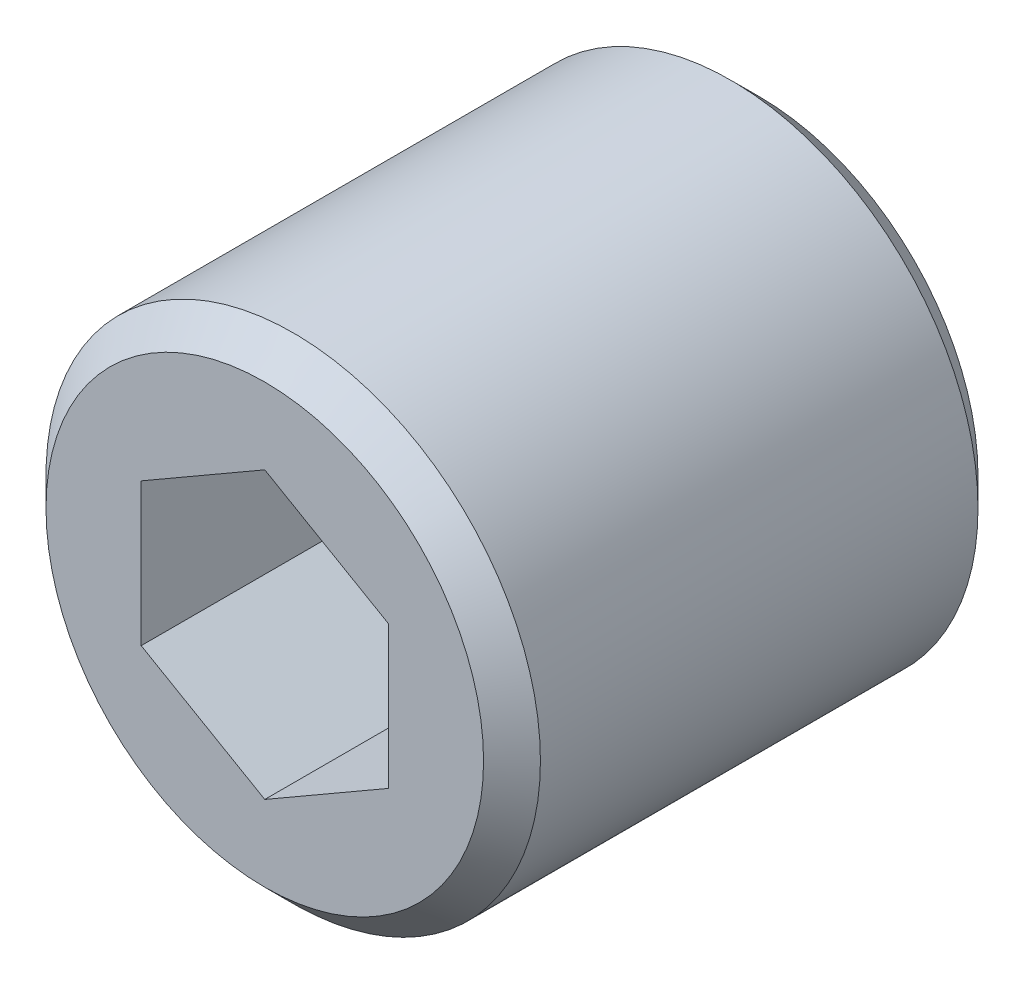
ISO-10303-21;
HEADER;
FILE_DESCRIPTION(('STEP AP214'),'2;1');
FILE_NAME('part.step','',(''),(''),'','','');
FILE_SCHEMA(('AUTOMOTIVE_DESIGN { 1 0 10303 214 1 1 1 1 }'));
ENDSEC;
DATA;
#1=APPLICATION_CONTEXT('core data for automotive mechanical design processes');
#2=APPLICATION_PROTOCOL_DEFINITION('international standard','automotive_design',2000,#1);
#3=PRODUCT_CONTEXT('',#1,'mechanical');
#4=PRODUCT('Part','Part','',(#3));
#5=PRODUCT_RELATED_PRODUCT_CATEGORY('part','',(#4));
#6=PRODUCT_DEFINITION_FORMATION('','',#4);
#7=PRODUCT_DEFINITION_CONTEXT('part definition',#1,'design');
#8=PRODUCT_DEFINITION('design','',#6,#7);
#9=PRODUCT_DEFINITION_SHAPE('','',#8);
#10=(LENGTH_UNIT() NAMED_UNIT(*) SI_UNIT(.MILLI.,.METRE.));
#11=(NAMED_UNIT(*) PLANE_ANGLE_UNIT() SI_UNIT($,.RADIAN.));
#12=(NAMED_UNIT(*) SI_UNIT($,.STERADIAN.) SOLID_ANGLE_UNIT());
#13=UNCERTAINTY_MEASURE_WITH_UNIT(LENGTH_MEASURE(1.E-05),#10,'distance_accuracy_value','');
#14=(GEOMETRIC_REPRESENTATION_CONTEXT(3) GLOBAL_UNCERTAINTY_ASSIGNED_CONTEXT((#13)) GLOBAL_UNIT_ASSIGNED_CONTEXT((#10,
#11,#12)) REPRESENTATION_CONTEXT('',''));
#15=CARTESIAN_POINT('',(0.,0.,0.));
#16=DIRECTION('',(0.,0.,1.));
#17=DIRECTION('',(1.,0.,0.));
#18=AXIS2_PLACEMENT_3D('',#15,#16,#17);
#19=CARTESIAN_POINT('',(0.,0.,8.));
#20=DIRECTION('',(0.,0.,-1.));
#21=DIRECTION('',(-1.,0.,0.));
#22=AXIS2_PLACEMENT_3D('',#19,#20,#21);
#23=PLANE('',#22);
#24=CARTESIAN_POINT('',(0.,0.,8.));
#25=DIRECTION('',(0.,0.,1.));
#26=DIRECTION('',(1.,0.,0.));
#27=AXIS2_PLACEMENT_3D('',#24,#25,#26);
#28=CIRCLE('',#27,3.54);
#29=CARTESIAN_POINT('',(3.54,0.,8.));
#30=VERTEX_POINT('',#29);
#31=EDGE_CURVE('E143',#30,#30,#28,.T.);
#32=ORIENTED_EDGE('',*,*,#31,.T.);
#33=EDGE_LOOP('',(#32));
#34=FACE_BOUND('',#33,.T.);
#35=DIRECTION('',(-0.866025403784439,-0.5,0.));
#36=VECTOR('',#35,1.);
#37=CARTESIAN_POINT('',(0.,2.3094010767585,8.));
#38=LINE('',#37,#36);
#39=CARTESIAN_POINT('',(0.,2.3094010767585,8.));
#40=VERTEX_POINT('',#39);
#41=CARTESIAN_POINT('',(-2.,1.15470053837925,8.));
#42=VERTEX_POINT('',#41);
#43=EDGE_CURVE('E111',#40,#42,#38,.T.);
#44=ORIENTED_EDGE('',*,*,#43,.F.);
#45=DIRECTION('',(-0.866025403784439,0.5,0.));
#46=VECTOR('',#45,1.);
#47=CARTESIAN_POINT('',(2.,1.15470053837925,8.));
#48=LINE('',#47,#46);
#49=CARTESIAN_POINT('',(2.,1.15470053837925,8.));
#50=VERTEX_POINT('',#49);
#51=EDGE_CURVE('E123',#50,#40,#48,.T.);
#52=ORIENTED_EDGE('',*,*,#51,.F.);
#53=DIRECTION('',(0.,1.,0.));
#54=VECTOR('',#53,1.);
#55=CARTESIAN_POINT('',(2.,-1.15470053837925,8.));
#56=LINE('',#55,#54);
#57=CARTESIAN_POINT('',(2.,-1.15470053837925,8.));
#58=VERTEX_POINT('',#57);
#59=EDGE_CURVE('E117',#58,#50,#56,.T.);
#60=ORIENTED_EDGE('',*,*,#59,.F.);
#61=DIRECTION('',(0.866025403784439,0.5,0.));
#62=VECTOR('',#61,1.);
#63=CARTESIAN_POINT('',(0.,-2.3094010767585,8.));
#64=LINE('',#63,#62);
#65=CARTESIAN_POINT('',(0.,-2.3094010767585,8.));
#66=VERTEX_POINT('',#65);
#67=EDGE_CURVE('E115',#66,#58,#64,.T.);
#68=ORIENTED_EDGE('',*,*,#67,.F.);
#69=DIRECTION('',(0.866025403784439,-0.5,0.));
#70=VECTOR('',#69,1.);
#71=CARTESIAN_POINT('',(-2.,-1.15470053837925,8.));
#72=LINE('',#71,#70);
#73=CARTESIAN_POINT('',(-2.,-1.15470053837925,8.));
#74=VERTEX_POINT('',#73);
#75=EDGE_CURVE('E96',#74,#66,#72,.T.);
#76=ORIENTED_EDGE('',*,*,#75,.F.);
#77=DIRECTION('',(0.,-1.,0.));
#78=VECTOR('',#77,1.);
#79=CARTESIAN_POINT('',(-2.,1.15470053837925,8.));
#80=LINE('',#79,#78);
#81=EDGE_CURVE('E105',#42,#74,#80,.T.);
#82=ORIENTED_EDGE('',*,*,#81,.F.);
#83=EDGE_LOOP('',(#44,#52,#60,#68,#76,#82));
#84=FACE_BOUND('',#83,.T.);
#85=ADVANCED_FACE('F37',(#34,#84),#23,.F.);
#86=CARTESIAN_POINT('',(0.,0.,7.54));
#87=DIRECTION('',(0.,0.,-1.));
#88=DIRECTION('',(-1.,0.,0.));
#89=AXIS2_PLACEMENT_3D('',#86,#87,#88);
#90=CONICAL_SURFACE('',#89,4.,0.785398163397448);
#91=ORIENTED_EDGE('',*,*,#31,.F.);
#92=EDGE_LOOP('',(#91));
#93=FACE_BOUND('',#92,.T.);
#94=CARTESIAN_POINT('',(0.,0.,7.54));
#95=DIRECTION('',(0.,0.,1.));
#96=DIRECTION('',(1.,0.,0.));
#97=AXIS2_PLACEMENT_3D('',#94,#95,#96);
#98=CIRCLE('',#97,4.);
#99=CARTESIAN_POINT('',(4.,0.,7.54));
#100=VERTEX_POINT('',#99);
#101=EDGE_CURVE('E140',#100,#100,#98,.T.);
#102=ORIENTED_EDGE('',*,*,#101,.T.);
#103=EDGE_LOOP('',(#102));
#104=FACE_BOUND('',#103,.T.);
#105=ADVANCED_FACE('F205',(#93,#104),#90,.T.);
#106=CARTESIAN_POINT('',(0.,0.,0.));
#107=DIRECTION('',(0.,0.,1.));
#108=DIRECTION('',(1.,0.,0.));
#109=AXIS2_PLACEMENT_3D('',#106,#107,#108);
#110=CYLINDRICAL_SURFACE('',#109,4.);
#111=ORIENTED_EDGE('',*,*,#101,.F.);
#112=EDGE_LOOP('',(#111));
#113=FACE_BOUND('',#112,.T.);
#114=CARTESIAN_POINT('',(0.,0.,0.46));
#115=DIRECTION('',(0.,0.,1.));
#116=DIRECTION('',(1.,0.,0.));
#117=AXIS2_PLACEMENT_3D('',#114,#115,#116);
#118=CIRCLE('',#117,4.);
#119=CARTESIAN_POINT('',(4.,0.,0.46));
#120=VERTEX_POINT('',#119);
#121=EDGE_CURVE('E137',#120,#120,#118,.T.);
#122=ORIENTED_EDGE('',*,*,#121,.T.);
#123=EDGE_LOOP('',(#122));
#124=FACE_BOUND('',#123,.T.);
#125=ADVANCED_FACE('F210',(#113,#124),#110,.T.);
#126=CARTESIAN_POINT('',(0.,0.,0.));
#127=DIRECTION('',(0.,0.,1.));
#128=DIRECTION('',(1.,0.,0.));
#129=AXIS2_PLACEMENT_3D('',#126,#127,#128);
#130=CONICAL_SURFACE('',#129,3.54,0.785398163397448);
#131=ORIENTED_EDGE('',*,*,#121,.F.);
#132=EDGE_LOOP('',(#131));
#133=FACE_BOUND('',#132,.T.);
#134=CARTESIAN_POINT('',(0.,0.,0.));
#135=DIRECTION('',(0.,0.,1.));
#136=DIRECTION('',(1.,0.,0.));
#137=AXIS2_PLACEMENT_3D('',#134,#135,#136);
#138=CIRCLE('',#137,3.54);
#139=CARTESIAN_POINT('',(3.54,0.,0.));
#140=VERTEX_POINT('',#139);
#141=EDGE_CURVE('E128',#140,#140,#138,.T.);
#142=ORIENTED_EDGE('',*,*,#141,.T.);
#143=EDGE_LOOP('',(#142));
#144=FACE_BOUND('',#143,.T.);
#145=ADVANCED_FACE('F218',(#133,#144),#130,.T.);
#146=CARTESIAN_POINT('',(0.,3.54,0.));
#147=DIRECTION('',(0.,0.,1.));
#148=DIRECTION('',(1.,0.,0.));
#149=AXIS2_PLACEMENT_3D('',#146,#147,#148);
#150=PLANE('',#149);
#151=ORIENTED_EDGE('',*,*,#141,.F.);
#152=EDGE_LOOP('',(#151));
#153=FACE_BOUND('',#152,.T.);
#154=ADVANCED_FACE('F164',(#153),#150,.F.);
#155=CARTESIAN_POINT('',(0.,2.3094010767585,2.));
#156=DIRECTION('',(-0.5,0.866025403784439,0.));
#157=DIRECTION('',(-0.866025403784439,-0.5,0.));
#158=AXIS2_PLACEMENT_3D('',#155,#156,#157);
#159=PLANE('',#158);
#160=CARTESIAN_POINT('',(0.00020000000000001,2.30951654681234,3.7113915370716));
#161=CARTESIAN_POINT('',(-0.08769126290006,2.25877250251758,3.68208160655178));
#162=CARTESIAN_POINT('',(-0.176341194473591,2.20759044065996,3.65542492243157));
#163=CARTESIAN_POINT('',(-0.355176246997802,2.10433997494456,3.60889456147183));
#164=CARTESIAN_POINT('',(-0.445364546505037,2.05226973594631,3.58903734683388));
#165=CARTESIAN_POINT('',(-0.624623385763306,1.94877459684592,3.55812553447436));
#166=CARTESIAN_POINT('',(-0.713666338226304,1.89736562427197,3.54686522204964));
#167=CARTESIAN_POINT('',(-0.892171397785043,1.79430568008402,3.53342073304575));
#168=CARTESIAN_POINT('',(-0.981632855703959,1.74265508327244,3.53122542540457));
#169=CARTESIAN_POINT('',(-1.1488083535488,1.64613626458981,3.53578305978175));
#170=CARTESIAN_POINT('',(-1.22654737026578,1.60125362236173,3.54141694513812));
#171=CARTESIAN_POINT('',(-1.38151891453613,1.51178075956051,3.55927596571193));
#172=CARTESIAN_POINT('',(-1.4587509057412,1.46719084864821,3.57150720647455));
#173=CARTESIAN_POINT('',(-1.6140421864822,1.37753338590959,3.60208550731872));
#174=CARTESIAN_POINT('',(-1.69208181310738,1.33247718647009,3.62056223751682));
#175=CARTESIAN_POINT('',(-1.84699686569214,1.24303693915875,3.66249758866396));
#176=CARTESIAN_POINT('',(-1.92387427762312,1.1986517446858,3.68594635094342));
#177=CARTESIAN_POINT('',(-2.0002,1.15458506832541,3.7113915370716));
#178=B_SPLINE_CURVE_WITH_KNOTS('',3,(#160,#161,#162,#163,#164,#165,#166,#167,#168,#169,#170,
#171,#172,#173,#174,#175,#176,#177),.UNSPECIFIED.,.F.,.F.,(4,2,2,2,2,2,2,2,4),(0.,
0.31703182469561,0.634825876346564,0.944753967652636,1.25430138000371,1.52387047293094,
1.79368946861028,2.06949491027634,2.34475850821472),.UNSPECIFIED.);
#179=CARTESIAN_POINT('',(0.,2.3094010767585,3.71132486540519));
#180=VERTEX_POINT('',#179);
#181=CARTESIAN_POINT('',(-2.,1.15470053837925,3.71132486540519));
#182=VERTEX_POINT('',#181);
#183=EDGE_CURVE('E11',#180,#182,#178,.T.);
#184=ORIENTED_EDGE('',*,*,#183,.F.);
#185=DIRECTION('',(0.,0.,1.));
#186=VECTOR('',#185,1.);
#187=CARTESIAN_POINT('',(0.,2.3094010767585,2.));
#188=LINE('',#187,#186);
#189=EDGE_CURVE('E126',#180,#40,#188,.T.);
#190=ORIENTED_EDGE('',*,*,#189,.T.);
#191=ORIENTED_EDGE('',*,*,#43,.T.);
#192=DIRECTION('',(0.,0.,1.));
#193=VECTOR('',#192,1.);
#194=CARTESIAN_POINT('',(-2.,1.15470053837925,2.));
#195=LINE('',#194,#193);
#196=EDGE_CURVE('E102',#182,#42,#195,.T.);
#197=ORIENTED_EDGE('',*,*,#196,.F.);
#198=EDGE_LOOP('',(#184,#190,#191,#197));
#199=FACE_BOUND('',#198,.T.);
#200=ADVANCED_FACE('F162',(#199),#159,.F.);
#201=CARTESIAN_POINT('',(2.,1.15470053837925,2.));
#202=DIRECTION('',(0.5,0.866025403784439,0.));
#203=DIRECTION('',(-0.866025403784439,0.5,0.));
#204=AXIS2_PLACEMENT_3D('',#201,#202,#203);
#205=PLANE('',#204);
#206=CARTESIAN_POINT('',(2.0002,1.15458506832541,3.7113915370716));
#207=CARTESIAN_POINT('',(1.91230873709994,1.20532911262018,3.68208160655178));
#208=CARTESIAN_POINT('',(1.82365880552641,1.2565111744778,3.65542492243157));
#209=CARTESIAN_POINT('',(1.6448237530022,1.35976164019319,3.60889456147183));
#210=CARTESIAN_POINT('',(1.55463545349496,1.41183187919145,3.58903734683388));
#211=CARTESIAN_POINT('',(1.37537661423669,1.51532701829183,3.55812553447436));
#212=CARTESIAN_POINT('',(1.2863336617737,1.56673599086578,3.54686522204964));
#213=CARTESIAN_POINT('',(1.10782860221496,1.66979593505373,3.53342073304575));
#214=CARTESIAN_POINT('',(1.01836714429604,1.72144653186531,3.53122542540457));
#215=CARTESIAN_POINT('',(0.851191646451202,1.81796535054794,3.53578305978175));
#216=CARTESIAN_POINT('',(0.773452629734216,1.86284799277603,3.54141694513812));
#217=CARTESIAN_POINT('',(0.618481085463866,1.95232085557725,3.55927596571193));
#218=CARTESIAN_POINT('',(0.541249094258801,1.99691076648954,3.57150720647455));
#219=CARTESIAN_POINT('',(0.385957813517799,2.08656822922816,3.60208550731872));
#220=CARTESIAN_POINT('',(0.30791818689262,2.13162442866767,3.62056223751682));
#221=CARTESIAN_POINT('',(0.153003134307865,2.221064675979,3.66249758866396));
#222=CARTESIAN_POINT('',(0.07612572237688,2.26544987045196,3.68594635094342));
#223=CARTESIAN_POINT('',(-0.000200000000000156,2.30951654681234,3.7113915370716));
#224=B_SPLINE_CURVE_WITH_KNOTS('',3,(#206,#207,#208,#209,#210,#211,#212,#213,#214,#215,#216,
#217,#218,#219,#220,#221,#222,#223),.UNSPECIFIED.,.F.,.F.,(4,2,2,2,2,2,2,2,4),(0.,
0.31703182469561,0.634825876346564,0.944753967652636,1.25430138000371,1.52387047293094,
1.79368946861028,2.06949491027634,2.34475850821472),.UNSPECIFIED.);
#225=CARTESIAN_POINT('',(2.,1.15470053837925,3.71132486540519));
#226=VERTEX_POINT('',#225);
#227=EDGE_CURVE('E49',#226,#180,#224,.T.);
#228=ORIENTED_EDGE('',*,*,#227,.F.);
#229=DIRECTION('',(0.,0.,1.));
#230=VECTOR('',#229,1.);
#231=CARTESIAN_POINT('',(2.,1.15470053837925,2.));
#232=LINE('',#231,#230);
#233=EDGE_CURVE('E129',#226,#50,#232,.T.);
#234=ORIENTED_EDGE('',*,*,#233,.T.);
#235=ORIENTED_EDGE('',*,*,#51,.T.);
#236=ORIENTED_EDGE('',*,*,#189,.F.);
#237=EDGE_LOOP('',(#228,#234,#235,#236));
#238=FACE_BOUND('',#237,.T.);
#239=ADVANCED_FACE('F187',(#238),#205,.F.);
#240=CARTESIAN_POINT('',(2.,-1.15470053837925,2.));
#241=DIRECTION('',(1.,0.,0.));
#242=DIRECTION('',(0.,0.,-1.));
#243=AXIS2_PLACEMENT_3D('',#240,#241,#242);
#244=PLANE('',#243);
#245=CARTESIAN_POINT('',(2.,-3.05481107316583,4.48606100378735));
#246=CARTESIAN_POINT('',(2.,-2.96780837922383,4.44404760603338));
#247=CARTESIAN_POINT('',(2.,-2.88060077912208,4.4024509918537));
#248=CARTESIAN_POINT('',(2.,-2.7056665435219,4.32032685668438));
#249=CARTESIAN_POINT('',(2.,-2.6179398242138,4.27979951442731));
#250=CARTESIAN_POINT('',(2.,-2.44138351094374,4.19983554749879));
#251=CARTESIAN_POINT('',(2.,-2.35255047887789,4.16040648676368));
#252=CARTESIAN_POINT('',(2.,-2.17416084860822,4.08322695369973));
#253=CARTESIAN_POINT('',(2.,-2.0846042863891,4.04547639849056));
#254=CARTESIAN_POINT('',(2.,-1.90198690826077,3.97102327772669));
#255=CARTESIAN_POINT('',(2.,-1.80890025218878,3.93438373513611));
#256=CARTESIAN_POINT('',(2.,-1.62162092652544,3.86399287998177));
#257=CARTESIAN_POINT('',(2.,-1.52742813188151,3.8302418976245));
#258=CARTESIAN_POINT('',(2.,-1.33797841957146,3.76654825112438));
#259=CARTESIAN_POINT('',(2.,-1.24272425998347,3.7365974684726));
#260=CARTESIAN_POINT('',(2.,-1.05085131159308,3.68149559207146));
#261=CARTESIAN_POINT('',(2.,-0.95423297757074,3.65634293751789));
#262=CARTESIAN_POINT('',(2.,-0.760069760967152,3.61219749428077));
#263=CARTESIAN_POINT('',(2.,-0.662531720799182,3.59317518137641));
#264=CARTESIAN_POINT('',(2.,-0.466294939271892,3.56240851772704));
#265=CARTESIAN_POINT('',(2.,-0.367596301113716,3.55066352479052));
#266=CARTESIAN_POINT('',(2.,-0.170796174875244,3.53554588904753));
#267=CARTESIAN_POINT('',(2.,-0.07270290527202,3.53206930724002));
#268=CARTESIAN_POINT('',(2.,0.123419722818751,3.5335004583254));
#269=CARTESIAN_POINT('',(2.,0.221449078061664,3.53840858805329));
#270=CARTESIAN_POINT('',(2.,0.459410536807089,3.56006803115966));
#271=CARTESIAN_POINT('',(2.,0.598959048032037,3.5810531120337));
#272=CARTESIAN_POINT('',(2.,0.875423530853441,3.63621712994731));
#273=CARTESIAN_POINT('',(2.,1.01233673736822,3.67040920820593));
#274=CARTESIAN_POINT('',(2.,1.28648851563559,3.74919227968267));
#275=CARTESIAN_POINT('',(2.,1.4236618666215,3.79400476928414));
#276=CARTESIAN_POINT('',(2.,1.62751768294478,3.86638742142437));
#277=CARTESIAN_POINT('',(2.,1.69514449559165,3.89137241777125));
#278=CARTESIAN_POINT('',(2.,1.82984580708184,3.94278957953844));
#279=CARTESIAN_POINT('',(2.,1.89692031685912,3.96922171623003));
#280=CARTESIAN_POINT('',(2.,2.07433118761071,4.04098186544869));
#281=CARTESIAN_POINT('',(2.,2.18424468484075,4.08735271738895));
#282=CARTESIAN_POINT('',(2.,2.40300708641383,4.18254928028313));
#283=CARTESIAN_POINT('',(2.,2.51185589460911,4.23137521054453));
#284=CARTESIAN_POINT('',(2.,2.72872724018632,4.33090577468046));
#285=CARTESIAN_POINT('',(2.,2.83674952485264,4.38161095747051));
#286=CARTESIAN_POINT('',(2.,3.05210537367069,4.48446586134284));
#287=CARTESIAN_POINT('',(2.,3.15943891993279,4.53661561976168));
#288=CARTESIAN_POINT('',(2.,3.4809020297907,4.69488949861796));
#289=CARTESIAN_POINT('',(2.,3.6941998578882,4.80270095093989));
#290=CARTESIAN_POINT('',(2.,4.11927585182613,5.02116801809101));
#291=CARTESIAN_POINT('',(2.,4.33105427852185,5.13182312900436));
#292=CARTESIAN_POINT('',(2.,4.73217209429741,5.34377513322136));
#293=CARTESIAN_POINT('',(2.,4.92161088876416,5.44488420909277));
#294=CARTESIAN_POINT('',(2.,5.29987783331688,5.64825993596207));
#295=CARTESIAN_POINT('',(2.,5.488705951056,5.75052664702804));
#296=CARTESIAN_POINT('',(2.,5.86534326187478,5.95562268788582));
#297=CARTESIAN_POINT('',(2.,6.05315382085116,6.05844951216807));
#298=CARTESIAN_POINT('',(2.,6.4283939190692,6.26476629080833));
#299=CARTESIAN_POINT('',(2.,6.61582348326623,6.36825619976096));
#300=CARTESIAN_POINT('',(2.,6.80311826335231,6.4719878724528));
#301=B_SPLINE_CURVE_WITH_KNOTS('',3,(#245,#246,#247,#248,#249,#250,#251,#252,#253,#254,#255,
#256,#257,#258,#259,#260,#261,#262,#263,#264,#265,#266,#267,#268,#269,#270,#271,#272,#273,#274,
#275,#276,#277,#278,#279,#280,#281,#282,#283,#284,#285,#286,#287,#288,#289,#290,#291,#292,#293,
#294,#295,#296,#297,#298,#299,#300),.UNSPECIFIED.,.F.,.F.,(4,2,2,2,2,2,2,2,2,2,2,2,2,2,2,2,2,2,
2,2,2,2,2,2,2,2,2,4),(0.,0.289850898688001,0.5797499439049,0.871307032974673,1.16284970967293,
1.46292639213332,1.76303733224436,2.06249593431385,2.36185695743948,2.65975390624981,
2.95762456321888,3.25173054126353,3.54585043926016,3.9683293468599,4.39122971661036,
4.82387639310282,5.04014940972729,5.25641813444447,5.61425911525281,5.97213211829985,
6.33011049018058,6.68809812303217,7.40504712549048,8.12186994400913,8.76606234459619,
9.4102883260718,10.0526383391105,10.6949448268992),.UNSPECIFIED.);
#302=CARTESIAN_POINT('',(2.,-1.15470053837925,3.71132486540519));
#303=VERTEX_POINT('',#302);
#304=EDGE_CURVE('E177',#303,#226,#301,.T.);
#305=ORIENTED_EDGE('',*,*,#304,.F.);
#306=DIRECTION('',(0.,0.,1.));
#307=VECTOR('',#306,1.);
#308=CARTESIAN_POINT('',(2.,-1.15470053837925,2.));
#309=LINE('',#308,#307);
#310=EDGE_CURVE('E131',#303,#58,#309,.T.);
#311=ORIENTED_EDGE('',*,*,#310,.T.);
#312=ORIENTED_EDGE('',*,*,#59,.T.);
#313=ORIENTED_EDGE('',*,*,#233,.F.);
#314=EDGE_LOOP('',(#305,#311,#312,#313));
#315=FACE_BOUND('',#314,.T.);
#316=ADVANCED_FACE('F190',(#315),#244,.F.);
#317=CARTESIAN_POINT('',(0.,-2.3094010767585,2.));
#318=DIRECTION('',(0.5,-0.866025403784439,0.));
#319=DIRECTION('',(0.866025403784439,0.5,0.));
#320=AXIS2_PLACEMENT_3D('',#317,#318,#319);
#321=PLANE('',#320);
#322=CARTESIAN_POINT('',(-0.00020000000000001,-2.30951654681234,3.7113915370716));
#323=CARTESIAN_POINT('',(0.08769126290006,-2.25877250251758,3.68208160655178));
#324=CARTESIAN_POINT('',(0.176341194473591,-2.20759044065996,3.65542492243157));
#325=CARTESIAN_POINT('',(0.355176246997802,-2.10433997494456,3.60889456147183));
#326=CARTESIAN_POINT('',(0.445364546505037,-2.05226973594631,3.58903734683388));
#327=CARTESIAN_POINT('',(0.624623385763306,-1.94877459684592,3.55812553447436));
#328=CARTESIAN_POINT('',(0.713666338226304,-1.89736562427197,3.54686522204964));
#329=CARTESIAN_POINT('',(0.892171397785043,-1.79430568008402,3.53342073304575));
#330=CARTESIAN_POINT('',(0.981632855703959,-1.74265508327244,3.53122542540457));
#331=CARTESIAN_POINT('',(1.1488083535488,-1.64613626458981,3.53578305978175));
#332=CARTESIAN_POINT('',(1.22654737026578,-1.60125362236173,3.54141694513812));
#333=CARTESIAN_POINT('',(1.38151891453613,-1.51178075956051,3.55927596571193));
#334=CARTESIAN_POINT('',(1.4587509057412,-1.46719084864821,3.57150720647455));
#335=CARTESIAN_POINT('',(1.6140421864822,-1.37753338590959,3.60208550731872));
#336=CARTESIAN_POINT('',(1.69208181310738,-1.33247718647009,3.62056223751682));
#337=CARTESIAN_POINT('',(1.84699686569214,-1.24303693915875,3.66249758866396));
#338=CARTESIAN_POINT('',(1.92387427762312,-1.1986517446858,3.68594635094342));
#339=CARTESIAN_POINT('',(2.0002,-1.15458506832541,3.7113915370716));
#340=B_SPLINE_CURVE_WITH_KNOTS('',3,(#322,#323,#324,#325,#326,#327,#328,#329,#330,#331,#332,
#333,#334,#335,#336,#337,#338,#339),.UNSPECIFIED.,.F.,.F.,(4,2,2,2,2,2,2,2,4),(0.,
0.31703182469561,0.634825876346564,0.944753967652636,1.25430138000371,1.52387047293094,
1.79368946861028,2.06949491027634,2.34475850821472),.UNSPECIFIED.);
#341=CARTESIAN_POINT('',(0.,-2.3094010767585,3.71132486540519));
#342=VERTEX_POINT('',#341);
#343=EDGE_CURVE('E171',#342,#303,#340,.T.);
#344=ORIENTED_EDGE('',*,*,#343,.F.);
#345=DIRECTION('',(0.,0.,1.));
#346=VECTOR('',#345,1.);
#347=CARTESIAN_POINT('',(0.,-2.3094010767585,2.));
#348=LINE('',#347,#346);
#349=EDGE_CURVE('E101',#342,#66,#348,.T.);
#350=ORIENTED_EDGE('',*,*,#349,.T.);
#351=ORIENTED_EDGE('',*,*,#67,.T.);
#352=ORIENTED_EDGE('',*,*,#310,.F.);
#353=EDGE_LOOP('',(#344,#350,#351,#352));
#354=FACE_BOUND('',#353,.T.);
#355=ADVANCED_FACE('F194',(#354),#321,.F.);
#356=CARTESIAN_POINT('',(-2.,-1.15470053837925,2.));
#357=DIRECTION('',(-0.5,-0.866025403784439,0.));
#358=DIRECTION('',(0.866025403784439,-0.5,0.));
#359=AXIS2_PLACEMENT_3D('',#356,#357,#358);
#360=PLANE('',#359);
#361=CARTESIAN_POINT('',(-2.0002,-1.15458506832541,3.7113915370716));
#362=CARTESIAN_POINT('',(-1.91230873709994,-1.20532911262018,3.68208160655178));
#363=CARTESIAN_POINT('',(-1.82365880552641,-1.2565111744778,3.65542492243157));
#364=CARTESIAN_POINT('',(-1.6448237530022,-1.35976164019319,3.60889456147183));
#365=CARTESIAN_POINT('',(-1.55463545349496,-1.41183187919145,3.58903734683388));
#366=CARTESIAN_POINT('',(-1.37537661423669,-1.51532701829183,3.55812553447436));
#367=CARTESIAN_POINT('',(-1.2863336617737,-1.56673599086578,3.54686522204964));
#368=CARTESIAN_POINT('',(-1.10782860221496,-1.66979593505373,3.53342073304575));
#369=CARTESIAN_POINT('',(-1.01836714429604,-1.72144653186531,3.53122542540457));
#370=CARTESIAN_POINT('',(-0.851191646451202,-1.81796535054794,3.53578305978175));
#371=CARTESIAN_POINT('',(-0.773452629734216,-1.86284799277603,3.54141694513812));
#372=CARTESIAN_POINT('',(-0.618481085463866,-1.95232085557725,3.55927596571193));
#373=CARTESIAN_POINT('',(-0.541249094258801,-1.99691076648954,3.57150720647455));
#374=CARTESIAN_POINT('',(-0.385957813517799,-2.08656822922816,3.60208550731872));
#375=CARTESIAN_POINT('',(-0.30791818689262,-2.13162442866767,3.62056223751682));
#376=CARTESIAN_POINT('',(-0.153003134307865,-2.221064675979,3.66249758866396));
#377=CARTESIAN_POINT('',(-0.07612572237688,-2.26544987045196,3.68594635094342));
#378=CARTESIAN_POINT('',(0.000200000000000156,-2.30951654681234,3.7113915370716));
#379=B_SPLINE_CURVE_WITH_KNOTS('',3,(#361,#362,#363,#364,#365,#366,#367,#368,#369,#370,#371,
#372,#373,#374,#375,#376,#377,#378),.UNSPECIFIED.,.F.,.F.,(4,2,2,2,2,2,2,2,4),(0.,
0.31703182469561,0.634825876346564,0.944753967652636,1.25430138000371,1.52387047293094,
1.79368946861028,2.06949491027634,2.34475850821472),.UNSPECIFIED.);
#380=CARTESIAN_POINT('',(-2.,-1.15470053838015,3.71132486540458));
#381=VERTEX_POINT('',#380);
#382=EDGE_CURVE('E99',#381,#342,#379,.T.);
#383=ORIENTED_EDGE('',*,*,#382,.F.);
#384=DIRECTION('',(0.,0.,1.));
#385=VECTOR('',#384,1.);
#386=CARTESIAN_POINT('',(-2.,-1.15470053837925,2.));
#387=LINE('',#386,#385);
#388=EDGE_CURVE('E56',#381,#74,#387,.T.);
#389=ORIENTED_EDGE('',*,*,#388,.T.);
#390=ORIENTED_EDGE('',*,*,#75,.T.);
#391=ORIENTED_EDGE('',*,*,#349,.F.);
#392=EDGE_LOOP('',(#383,#389,#390,#391));
#393=FACE_BOUND('',#392,.T.);
#394=ADVANCED_FACE('F93',(#393),#360,.F.);
#395=CARTESIAN_POINT('',(-2.,1.15470053837925,2.));
#396=DIRECTION('',(-1.,0.,0.));
#397=DIRECTION('',(0.,0.,1.));
#398=AXIS2_PLACEMENT_3D('',#395,#396,#397);
#399=PLANE('',#398);
#400=CARTESIAN_POINT('',(-2.,-3.05481107316583,4.48606100378735));
#401=CARTESIAN_POINT('',(-2.,-2.96780837922383,4.44404760603338));
#402=CARTESIAN_POINT('',(-2.,-2.88060077912208,4.4024509918537));
#403=CARTESIAN_POINT('',(-2.,-2.7056665435219,4.32032685668438));
#404=CARTESIAN_POINT('',(-2.,-2.6179398242138,4.27979951442731));
#405=CARTESIAN_POINT('',(-2.,-2.44138351094374,4.19983554749879));
#406=CARTESIAN_POINT('',(-2.,-2.35255047887789,4.16040648676368));
#407=CARTESIAN_POINT('',(-2.,-2.17416084860822,4.08322695369973));
#408=CARTESIAN_POINT('',(-2.,-2.0846042863891,4.04547639849056));
#409=CARTESIAN_POINT('',(-2.,-1.90198690826077,3.97102327772669));
#410=CARTESIAN_POINT('',(-2.,-1.80890025218878,3.93438373513611));
#411=CARTESIAN_POINT('',(-2.,-1.62162092652544,3.86399287998177));
#412=CARTESIAN_POINT('',(-2.,-1.52742813188151,3.8302418976245));
#413=CARTESIAN_POINT('',(-2.,-1.33797841957146,3.76654825112438));
#414=CARTESIAN_POINT('',(-2.,-1.24272425998347,3.7365974684726));
#415=CARTESIAN_POINT('',(-2.,-1.05085131159308,3.68149559207146));
#416=CARTESIAN_POINT('',(-2.,-0.95423297757074,3.65634293751789));
#417=CARTESIAN_POINT('',(-2.,-0.760069760967152,3.61219749428077));
#418=CARTESIAN_POINT('',(-2.,-0.662531720799182,3.59317518137641));
#419=CARTESIAN_POINT('',(-2.,-0.466294939271892,3.56240851772704));
#420=CARTESIAN_POINT('',(-2.,-0.367596301113716,3.55066352479052));
#421=CARTESIAN_POINT('',(-2.,-0.170796174875244,3.53554588904753));
#422=CARTESIAN_POINT('',(-2.,-0.07270290527202,3.53206930724002));
#423=CARTESIAN_POINT('',(-2.,0.123419722818751,3.5335004583254));
#424=CARTESIAN_POINT('',(-2.,0.221449078061664,3.53840858805329));
#425=CARTESIAN_POINT('',(-2.,0.459410536807089,3.56006803115966));
#426=CARTESIAN_POINT('',(-2.,0.598959048032037,3.5810531120337));
#427=CARTESIAN_POINT('',(-2.,0.875423530853441,3.63621712994731));
#428=CARTESIAN_POINT('',(-2.,1.01233673736822,3.67040920820593));
#429=CARTESIAN_POINT('',(-2.,1.28648851563559,3.74919227968267));
#430=CARTESIAN_POINT('',(-2.,1.4236618666215,3.79400476928414));
#431=CARTESIAN_POINT('',(-2.,1.62751768294478,3.86638742142437));
#432=CARTESIAN_POINT('',(-2.,1.69514449559165,3.89137241777125));
#433=CARTESIAN_POINT('',(-2.,1.82984580708184,3.94278957953844));
#434=CARTESIAN_POINT('',(-2.,1.89692031685912,3.96922171623003));
#435=CARTESIAN_POINT('',(-2.,2.07433118761071,4.04098186544869));
#436=CARTESIAN_POINT('',(-2.,2.18424468484075,4.08735271738895));
#437=CARTESIAN_POINT('',(-2.,2.40300708641383,4.18254928028313));
#438=CARTESIAN_POINT('',(-2.,2.51185589460911,4.23137521054453));
#439=CARTESIAN_POINT('',(-2.,2.72872724018632,4.33090577468046));
#440=CARTESIAN_POINT('',(-2.,2.83674952485264,4.38161095747051));
#441=CARTESIAN_POINT('',(-2.,3.05210537367069,4.48446586134284));
#442=CARTESIAN_POINT('',(-2.,3.15943891993279,4.53661561976168));
#443=CARTESIAN_POINT('',(-2.,3.4809020297907,4.69488949861796));
#444=CARTESIAN_POINT('',(-2.,3.6941998578882,4.80270095093989));
#445=CARTESIAN_POINT('',(-2.,4.11927585182613,5.02116801809101));
#446=CARTESIAN_POINT('',(-2.,4.33105427852185,5.13182312900436));
#447=CARTESIAN_POINT('',(-2.,4.73217209429741,5.34377513322136));
#448=CARTESIAN_POINT('',(-2.,4.92161088876416,5.44488420909277));
#449=CARTESIAN_POINT('',(-2.,5.29987783331688,5.64825993596207));
#450=CARTESIAN_POINT('',(-2.,5.488705951056,5.75052664702804));
#451=CARTESIAN_POINT('',(-2.,5.86534326187478,5.95562268788582));
#452=CARTESIAN_POINT('',(-2.,6.05315382085116,6.05844951216807));
#453=CARTESIAN_POINT('',(-2.,6.4283939190692,6.26476629080833));
#454=CARTESIAN_POINT('',(-2.,6.61582348326623,6.36825619976096));
#455=CARTESIAN_POINT('',(-2.,6.80311826335231,6.4719878724528));
#456=B_SPLINE_CURVE_WITH_KNOTS('',3,(#400,#401,#402,#403,#404,#405,#406,#407,#408,#409,#410,
#411,#412,#413,#414,#415,#416,#417,#418,#419,#420,#421,#422,#423,#424,#425,#426,#427,#428,#429,
#430,#431,#432,#433,#434,#435,#436,#437,#438,#439,#440,#441,#442,#443,#444,#445,#446,#447,#448,
#449,#450,#451,#452,#453,#454,#455),.UNSPECIFIED.,.F.,.F.,(4,2,2,2,2,2,2,2,2,2,2,2,2,2,2,2,2,2,
2,2,2,2,2,2,2,2,2,4),(0.,0.289850898688001,0.5797499439049,0.871307032974673,1.16284970967293,
1.46292639213332,1.76303733224436,2.06249593431385,2.36185695743948,2.65975390624981,
2.95762456321888,3.25173054126353,3.54585043926016,3.9683293468599,4.39122971661036,
4.82387639310282,5.04014940972729,5.25641813444447,5.61425911525281,5.97213211829985,
6.33011049018058,6.68809812303217,7.40504712549048,8.12186994400913,8.76606234459619,
9.4102883260718,10.0526383391105,10.6949448268992),.UNSPECIFIED.);
#457=EDGE_CURVE('E146',#182,#381,#456,.F.);
#458=ORIENTED_EDGE('',*,*,#457,.F.);
#459=ORIENTED_EDGE('',*,*,#196,.T.);
#460=ORIENTED_EDGE('',*,*,#81,.T.);
#461=ORIENTED_EDGE('',*,*,#388,.F.);
#462=EDGE_LOOP('',(#458,#459,#460,#461));
#463=FACE_BOUND('',#462,.T.);
#464=ADVANCED_FACE('F106',(#463),#399,.F.);
#465=CARTESIAN_POINT('',(0.,0.,2.37799153207185));
#466=DIRECTION('',(0.,0.,1.));
#467=DIRECTION('',(1.,0.,0.));
#468=AXIS2_PLACEMENT_3D('',#465,#466,#467);
#469=CONICAL_SURFACE('',#468,0.,1.0471975511966);
#470=CARTESIAN_POINT('',(0.,0.,2.37799153207185));
#471=VERTEX_POINT('',#470);
#472=VERTEX_LOOP('',#471);
#473=FACE_BOUND('',#472,.T.);
#474=ORIENTED_EDGE('',*,*,#227,.T.);
#475=ORIENTED_EDGE('',*,*,#183,.T.);
#476=ORIENTED_EDGE('',*,*,#457,.T.);
#477=ORIENTED_EDGE('',*,*,#382,.T.);
#478=ORIENTED_EDGE('',*,*,#343,.T.);
#479=ORIENTED_EDGE('',*,*,#304,.T.);
#480=EDGE_LOOP('',(#474,#475,#476,#477,#478,#479));
#481=FACE_BOUND('',#480,.T.);
#482=ADVANCED_FACE('F158',(#473,#481),#469,.F.);
#483=CLOSED_SHELL('',(#85,#105,#125,#145,#154,#200,#239,#316,#355,#394,#464,#482));
#484=MANIFOLD_SOLID_BREP('B2',#483);
#485=ADVANCED_BREP_SHAPE_REPRESENTATION('',(#18,#484),#14);
#486=SHAPE_DEFINITION_REPRESENTATION(#9,#485);
ENDSEC;
END-ISO-10303-21;
